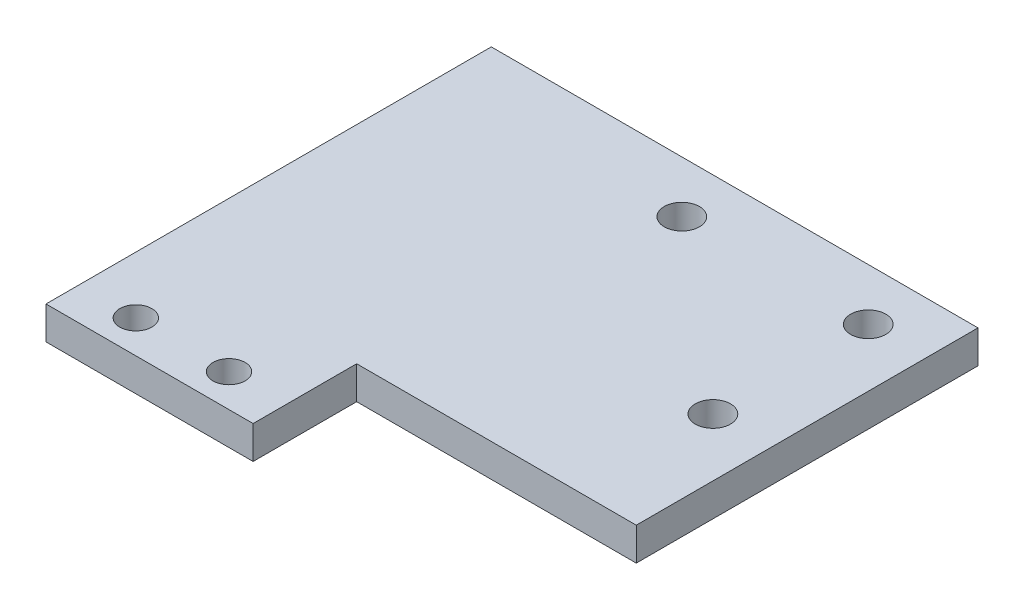
ISO-10303-21;
HEADER;
FILE_DESCRIPTION(('STEP AP214'),'2;1');
FILE_NAME('part.step','',(''),(''),'','','');
FILE_SCHEMA(('AUTOMOTIVE_DESIGN { 1 0 10303 214 1 1 1 1 }'));
ENDSEC;
DATA;
#1=APPLICATION_CONTEXT('core data for automotive mechanical design processes');
#2=APPLICATION_PROTOCOL_DEFINITION('international standard','automotive_design',2000,#1);
#3=PRODUCT_CONTEXT('',#1,'mechanical');
#4=PRODUCT('Part','Part','',(#3));
#5=PRODUCT_RELATED_PRODUCT_CATEGORY('part','',(#4));
#6=PRODUCT_DEFINITION_FORMATION('','',#4);
#7=PRODUCT_DEFINITION_CONTEXT('part definition',#1,'design');
#8=PRODUCT_DEFINITION('design','',#6,#7);
#9=PRODUCT_DEFINITION_SHAPE('','',#8);
#10=(LENGTH_UNIT() NAMED_UNIT(*) SI_UNIT(.MILLI.,.METRE.));
#11=(NAMED_UNIT(*) PLANE_ANGLE_UNIT() SI_UNIT($,.RADIAN.));
#12=(NAMED_UNIT(*) SI_UNIT($,.STERADIAN.) SOLID_ANGLE_UNIT());
#13=UNCERTAINTY_MEASURE_WITH_UNIT(LENGTH_MEASURE(1.E-05),#10,'distance_accuracy_value','');
#14=(GEOMETRIC_REPRESENTATION_CONTEXT(3) GLOBAL_UNCERTAINTY_ASSIGNED_CONTEXT((#13)) GLOBAL_UNIT_ASSIGNED_CONTEXT((#10,
#11,#12)) REPRESENTATION_CONTEXT('',''));
#15=CARTESIAN_POINT('',(0.,0.,0.));
#16=DIRECTION('',(0.,0.,1.));
#17=DIRECTION('',(1.,0.,0.));
#18=AXIS2_PLACEMENT_3D('',#15,#16,#17);
#19=CARTESIAN_POINT('',(0.,3.175,0.));
#20=DIRECTION('',(0.,-1.,0.));
#21=DIRECTION('',(0.,0.,-1.));
#22=AXIS2_PLACEMENT_3D('',#19,#20,#21);
#23=PLANE('',#22);
#24=DIRECTION('',(1.,0.,0.));
#25=VECTOR('',#24,1.);
#26=CARTESIAN_POINT('',(0.,3.175,0.));
#27=LINE('',#26,#25);
#28=CARTESIAN_POINT('',(0.,3.175,0.));
#29=VERTEX_POINT('',#28);
#30=CARTESIAN_POINT('',(19.9999999999988,3.175,0.));
#31=VERTEX_POINT('',#30);
#32=EDGE_CURVE('E139',#29,#31,#27,.T.);
#33=ORIENTED_EDGE('',*,*,#32,.T.);
#34=DIRECTION('',(0.,0.,-1.));
#35=VECTOR('',#34,1.);
#36=CARTESIAN_POINT('',(19.999999999999,3.175,-10.));
#37=LINE('',#36,#35);
#38=CARTESIAN_POINT('',(19.999999999999,3.175,-10.));
#39=VERTEX_POINT('',#38);
#40=EDGE_CURVE('E97',#31,#39,#37,.T.);
#41=ORIENTED_EDGE('',*,*,#40,.T.);
#42=DIRECTION('',(1.,0.,0.));
#43=VECTOR('',#42,1.);
#44=CARTESIAN_POINT('',(47.,3.175,-10.));
#45=LINE('',#44,#43);
#46=CARTESIAN_POINT('',(47.,3.175,-10.));
#47=VERTEX_POINT('',#46);
#48=EDGE_CURVE('E110',#39,#47,#45,.T.);
#49=ORIENTED_EDGE('',*,*,#48,.T.);
#50=DIRECTION('',(0.,0.,-1.));
#51=VECTOR('',#50,1.);
#52=CARTESIAN_POINT('',(47.,3.175,-43.));
#53=LINE('',#52,#51);
#54=CARTESIAN_POINT('',(47.,3.175,-43.));
#55=VERTEX_POINT('',#54);
#56=EDGE_CURVE('E104',#47,#55,#53,.T.);
#57=ORIENTED_EDGE('',*,*,#56,.T.);
#58=DIRECTION('',(-1.,0.,0.));
#59=VECTOR('',#58,1.);
#60=CARTESIAN_POINT('',(0.,3.175,-43.));
#61=LINE('',#60,#59);
#62=CARTESIAN_POINT('',(0.,3.175,-43.));
#63=VERTEX_POINT('',#62);
#64=EDGE_CURVE('E108',#55,#63,#61,.T.);
#65=ORIENTED_EDGE('',*,*,#64,.T.);
#66=DIRECTION('',(0.,0.,1.));
#67=VECTOR('',#66,1.);
#68=CARTESIAN_POINT('',(0.,3.175,0.));
#69=LINE('',#68,#67);
#70=EDGE_CURVE('E60',#63,#29,#69,.T.);
#71=ORIENTED_EDGE('',*,*,#70,.T.);
#72=EDGE_LOOP('',(#33,#41,#49,#57,#65,#71));
#73=FACE_BOUND('',#72,.T.);
#74=CARTESIAN_POINT('',(41.399999999998,3.175,-23.));
#75=DIRECTION('',(0.,1.,0.));
#76=DIRECTION('',(0.,0.,1.));
#77=AXIS2_PLACEMENT_3D('',#74,#75,#76);
#78=CIRCLE('',#77,1.69999999999997);
#79=CARTESIAN_POINT('',(41.399999999998,3.175,-21.3));
#80=VERTEX_POINT('',#79);
#81=EDGE_CURVE('E132',#80,#80,#78,.T.);
#82=ORIENTED_EDGE('',*,*,#81,.F.);
#83=EDGE_LOOP('',(#82));
#84=FACE_BOUND('',#83,.T.);
#85=CARTESIAN_POINT('',(41.399999999998,3.175,-38.));
#86=DIRECTION('',(0.,1.,0.));
#87=DIRECTION('',(0.,0.,1.));
#88=AXIS2_PLACEMENT_3D('',#85,#86,#87);
#89=CIRCLE('',#88,1.69999999999997);
#90=CARTESIAN_POINT('',(41.399999999998,3.175,-36.3));
#91=VERTEX_POINT('',#90);
#92=EDGE_CURVE('E213',#91,#91,#89,.T.);
#93=ORIENTED_EDGE('',*,*,#92,.F.);
#94=EDGE_LOOP('',(#93));
#95=FACE_BOUND('',#94,.T.);
#96=CARTESIAN_POINT('',(23.3999999999979,3.175,-38.));
#97=DIRECTION('',(0.,1.,0.));
#98=DIRECTION('',(0.,0.,1.));
#99=AXIS2_PLACEMENT_3D('',#96,#97,#98);
#100=CIRCLE('',#99,1.69999999999997);
#101=CARTESIAN_POINT('',(23.3999999999979,3.175,-36.3));
#102=VERTEX_POINT('',#101);
#103=EDGE_CURVE('E207',#102,#102,#100,.T.);
#104=ORIENTED_EDGE('',*,*,#103,.F.);
#105=EDGE_LOOP('',(#104));
#106=FACE_BOUND('',#105,.T.);
#107=CARTESIAN_POINT('',(14.4999999999994,3.175,-3.175));
#108=DIRECTION('',(0.,1.,0.));
#109=DIRECTION('',(0.,0.,1.));
#110=AXIS2_PLACEMENT_3D('',#107,#108,#109);
#111=CIRCLE('',#110,1.55);
#112=CARTESIAN_POINT('',(14.4999999999994,3.175,-1.625));
#113=VERTEX_POINT('',#112);
#114=EDGE_CURVE('E201',#113,#113,#111,.T.);
#115=ORIENTED_EDGE('',*,*,#114,.F.);
#116=EDGE_LOOP('',(#115));
#117=FACE_BOUND('',#116,.T.);
#118=CARTESIAN_POINT('',(5.49999999999938,3.175,-3.175));
#119=DIRECTION('',(0.,1.,0.));
#120=DIRECTION('',(0.,0.,1.));
#121=AXIS2_PLACEMENT_3D('',#118,#119,#120);
#122=CIRCLE('',#121,1.55);
#123=CARTESIAN_POINT('',(5.49999999999938,3.175,-1.625));
#124=VERTEX_POINT('',#123);
#125=EDGE_CURVE('E192',#124,#124,#122,.T.);
#126=ORIENTED_EDGE('',*,*,#125,.F.);
#127=EDGE_LOOP('',(#126));
#128=FACE_BOUND('',#127,.T.);
#129=ADVANCED_FACE('F43',(#73,#84,#95,#106,#117,#128),#23,.F.);
#130=CARTESIAN_POINT('',(0.,0.,0.));
#131=DIRECTION('',(0.,-1.,0.));
#132=DIRECTION('',(0.,0.,-1.));
#133=AXIS2_PLACEMENT_3D('',#130,#131,#132);
#134=PLANE('',#133);
#135=CARTESIAN_POINT('',(14.4999999999994,0.,-3.175));
#136=DIRECTION('',(0.,1.,0.));
#137=DIRECTION('',(0.,0.,1.));
#138=AXIS2_PLACEMENT_3D('',#135,#136,#137);
#139=CIRCLE('',#138,1.55);
#140=CARTESIAN_POINT('',(14.4999999999994,0.,-1.625));
#141=VERTEX_POINT('',#140);
#142=EDGE_CURVE('E198',#141,#141,#139,.T.);
#143=ORIENTED_EDGE('',*,*,#142,.T.);
#144=EDGE_LOOP('',(#143));
#145=FACE_BOUND('',#144,.T.);
#146=CARTESIAN_POINT('',(41.399999999998,0.,-38.));
#147=DIRECTION('',(0.,1.,0.));
#148=DIRECTION('',(0.,0.,1.));
#149=AXIS2_PLACEMENT_3D('',#146,#147,#148);
#150=CIRCLE('',#149,1.69999999999997);
#151=CARTESIAN_POINT('',(41.399999999998,0.,-36.3));
#152=VERTEX_POINT('',#151);
#153=EDGE_CURVE('E210',#152,#152,#150,.T.);
#154=ORIENTED_EDGE('',*,*,#153,.T.);
#155=EDGE_LOOP('',(#154));
#156=FACE_BOUND('',#155,.T.);
#157=DIRECTION('',(1.,0.,0.));
#158=VECTOR('',#157,1.);
#159=CARTESIAN_POINT('',(0.,0.,0.));
#160=LINE('',#159,#158);
#161=CARTESIAN_POINT('',(0.,0.,0.));
#162=VERTEX_POINT('',#161);
#163=CARTESIAN_POINT('',(19.9999999999988,0.,0.));
#164=VERTEX_POINT('',#163);
#165=EDGE_CURVE('E128',#162,#164,#160,.T.);
#166=ORIENTED_EDGE('',*,*,#165,.F.);
#167=DIRECTION('',(0.,0.,1.));
#168=VECTOR('',#167,1.);
#169=CARTESIAN_POINT('',(0.,0.,0.));
#170=LINE('',#169,#168);
#171=CARTESIAN_POINT('',(0.,0.,-43.));
#172=VERTEX_POINT('',#171);
#173=EDGE_CURVE('E89',#172,#162,#170,.T.);
#174=ORIENTED_EDGE('',*,*,#173,.F.);
#175=DIRECTION('',(-1.,0.,0.));
#176=VECTOR('',#175,1.);
#177=CARTESIAN_POINT('',(0.,0.,-43.));
#178=LINE('',#177,#176);
#179=CARTESIAN_POINT('',(47.,0.,-43.));
#180=VERTEX_POINT('',#179);
#181=EDGE_CURVE('E83',#180,#172,#178,.T.);
#182=ORIENTED_EDGE('',*,*,#181,.F.);
#183=DIRECTION('',(0.,0.,-1.));
#184=VECTOR('',#183,1.);
#185=CARTESIAN_POINT('',(47.,0.,-43.));
#186=LINE('',#185,#184);
#187=CARTESIAN_POINT('',(47.,0.,-10.));
#188=VERTEX_POINT('',#187);
#189=EDGE_CURVE('E118',#188,#180,#186,.T.);
#190=ORIENTED_EDGE('',*,*,#189,.F.);
#191=DIRECTION('',(1.,0.,0.));
#192=VECTOR('',#191,1.);
#193=CARTESIAN_POINT('',(47.,0.,-10.));
#194=LINE('',#193,#192);
#195=CARTESIAN_POINT('',(19.999999999999,0.,-10.));
#196=VERTEX_POINT('',#195);
#197=EDGE_CURVE('E134',#196,#188,#194,.T.);
#198=ORIENTED_EDGE('',*,*,#197,.F.);
#199=DIRECTION('',(0.,0.,-1.));
#200=VECTOR('',#199,1.);
#201=CARTESIAN_POINT('',(19.999999999999,0.,-10.));
#202=LINE('',#201,#200);
#203=EDGE_CURVE('E131',#164,#196,#202,.T.);
#204=ORIENTED_EDGE('',*,*,#203,.F.);
#205=EDGE_LOOP('',(#166,#174,#182,#190,#198,#204));
#206=FACE_BOUND('',#205,.T.);
#207=CARTESIAN_POINT('',(41.399999999998,0.,-23.));
#208=DIRECTION('',(0.,1.,0.));
#209=DIRECTION('',(0.,0.,1.));
#210=AXIS2_PLACEMENT_3D('',#207,#208,#209);
#211=CIRCLE('',#210,1.69999999999997);
#212=CARTESIAN_POINT('',(41.399999999998,0.,-21.3));
#213=VERTEX_POINT('',#212);
#214=EDGE_CURVE('E216',#213,#213,#211,.T.);
#215=ORIENTED_EDGE('',*,*,#214,.T.);
#216=EDGE_LOOP('',(#215));
#217=FACE_BOUND('',#216,.T.);
#218=CARTESIAN_POINT('',(23.3999999999979,0.,-38.));
#219=DIRECTION('',(0.,1.,0.));
#220=DIRECTION('',(0.,0.,1.));
#221=AXIS2_PLACEMENT_3D('',#218,#219,#220);
#222=CIRCLE('',#221,1.69999999999997);
#223=CARTESIAN_POINT('',(23.3999999999979,0.,-36.3));
#224=VERTEX_POINT('',#223);
#225=EDGE_CURVE('E204',#224,#224,#222,.T.);
#226=ORIENTED_EDGE('',*,*,#225,.T.);
#227=EDGE_LOOP('',(#226));
#228=FACE_BOUND('',#227,.T.);
#229=CARTESIAN_POINT('',(5.49999999999938,0.,-3.175));
#230=DIRECTION('',(0.,1.,0.));
#231=DIRECTION('',(0.,0.,1.));
#232=AXIS2_PLACEMENT_3D('',#229,#230,#231);
#233=CIRCLE('',#232,1.55);
#234=CARTESIAN_POINT('',(5.49999999999938,0.,-1.625));
#235=VERTEX_POINT('',#234);
#236=EDGE_CURVE('E195',#235,#235,#233,.T.);
#237=ORIENTED_EDGE('',*,*,#236,.T.);
#238=EDGE_LOOP('',(#237));
#239=FACE_BOUND('',#238,.T.);
#240=ADVANCED_FACE('F148',(#145,#156,#206,#217,#228,#239),#134,.T.);
#241=CARTESIAN_POINT('',(0.,3.175,0.));
#242=DIRECTION('',(0.,0.,-1.));
#243=DIRECTION('',(-1.,0.,0.));
#244=AXIS2_PLACEMENT_3D('',#241,#242,#243);
#245=PLANE('',#244);
#246=ORIENTED_EDGE('',*,*,#165,.T.);
#247=DIRECTION('',(0.,-1.,0.));
#248=VECTOR('',#247,1.);
#249=CARTESIAN_POINT('',(19.9999999999988,3.175,0.));
#250=LINE('',#249,#248);
#251=EDGE_CURVE('E11',#31,#164,#250,.T.);
#252=ORIENTED_EDGE('',*,*,#251,.F.);
#253=ORIENTED_EDGE('',*,*,#32,.F.);
#254=DIRECTION('',(0.,-1.,0.));
#255=VECTOR('',#254,1.);
#256=CARTESIAN_POINT('',(0.,3.175,0.));
#257=LINE('',#256,#255);
#258=EDGE_CURVE('E124',#29,#162,#257,.T.);
#259=ORIENTED_EDGE('',*,*,#258,.T.);
#260=EDGE_LOOP('',(#246,#252,#253,#259));
#261=FACE_BOUND('',#260,.T.);
#262=ADVANCED_FACE('F45',(#261),#245,.F.);
#263=CARTESIAN_POINT('',(19.999999999999,3.175,-10.));
#264=DIRECTION('',(-1.,0.,0.));
#265=DIRECTION('',(0.,0.,1.));
#266=AXIS2_PLACEMENT_3D('',#263,#264,#265);
#267=PLANE('',#266);
#268=ORIENTED_EDGE('',*,*,#203,.T.);
#269=DIRECTION('',(0.,-1.,0.));
#270=VECTOR('',#269,1.);
#271=CARTESIAN_POINT('',(19.999999999999,3.175,-10.));
#272=LINE('',#271,#270);
#273=EDGE_CURVE('E52',#39,#196,#272,.T.);
#274=ORIENTED_EDGE('',*,*,#273,.F.);
#275=ORIENTED_EDGE('',*,*,#40,.F.);
#276=ORIENTED_EDGE('',*,*,#251,.T.);
#277=EDGE_LOOP('',(#268,#274,#275,#276));
#278=FACE_BOUND('',#277,.T.);
#279=ADVANCED_FACE('F290',(#278),#267,.F.);
#280=CARTESIAN_POINT('',(47.,3.175,-10.));
#281=DIRECTION('',(0.,0.,-1.));
#282=DIRECTION('',(-1.,0.,0.));
#283=AXIS2_PLACEMENT_3D('',#280,#281,#282);
#284=PLANE('',#283);
#285=ORIENTED_EDGE('',*,*,#197,.T.);
#286=DIRECTION('',(0.,-1.,0.));
#287=VECTOR('',#286,1.);
#288=CARTESIAN_POINT('',(47.,3.175,-10.));
#289=LINE('',#288,#287);
#290=EDGE_CURVE('E119',#47,#188,#289,.T.);
#291=ORIENTED_EDGE('',*,*,#290,.F.);
#292=ORIENTED_EDGE('',*,*,#48,.F.);
#293=ORIENTED_EDGE('',*,*,#273,.T.);
#294=EDGE_LOOP('',(#285,#291,#292,#293));
#295=FACE_BOUND('',#294,.T.);
#296=ADVANCED_FACE('F145',(#295),#284,.F.);
#297=CARTESIAN_POINT('',(47.,3.175,-43.));
#298=DIRECTION('',(-1.,0.,0.));
#299=DIRECTION('',(0.,0.,1.));
#300=AXIS2_PLACEMENT_3D('',#297,#298,#299);
#301=PLANE('',#300);
#302=ORIENTED_EDGE('',*,*,#189,.T.);
#303=DIRECTION('',(0.,-1.,0.));
#304=VECTOR('',#303,1.);
#305=CARTESIAN_POINT('',(47.,3.175,-43.));
#306=LINE('',#305,#304);
#307=EDGE_CURVE('E115',#55,#180,#306,.T.);
#308=ORIENTED_EDGE('',*,*,#307,.F.);
#309=ORIENTED_EDGE('',*,*,#56,.F.);
#310=ORIENTED_EDGE('',*,*,#290,.T.);
#311=EDGE_LOOP('',(#302,#308,#309,#310));
#312=FACE_BOUND('',#311,.T.);
#313=ADVANCED_FACE('F116',(#312),#301,.F.);
#314=CARTESIAN_POINT('',(0.,3.175,-43.));
#315=DIRECTION('',(0.,0.,1.));
#316=DIRECTION('',(1.,0.,0.));
#317=AXIS2_PLACEMENT_3D('',#314,#315,#316);
#318=PLANE('',#317);
#319=ORIENTED_EDGE('',*,*,#181,.T.);
#320=DIRECTION('',(0.,-1.,0.));
#321=VECTOR('',#320,1.);
#322=CARTESIAN_POINT('',(0.,3.175,-43.));
#323=LINE('',#322,#321);
#324=EDGE_CURVE('E120',#63,#172,#323,.T.);
#325=ORIENTED_EDGE('',*,*,#324,.F.);
#326=ORIENTED_EDGE('',*,*,#64,.F.);
#327=ORIENTED_EDGE('',*,*,#307,.T.);
#328=EDGE_LOOP('',(#319,#325,#326,#327));
#329=FACE_BOUND('',#328,.T.);
#330=ADVANCED_FACE('F122',(#329),#318,.F.);
#331=CARTESIAN_POINT('',(0.,3.175,0.));
#332=DIRECTION('',(1.,0.,0.));
#333=DIRECTION('',(0.,0.,-1.));
#334=AXIS2_PLACEMENT_3D('',#331,#332,#333);
#335=PLANE('',#334);
#336=ORIENTED_EDGE('',*,*,#173,.T.);
#337=ORIENTED_EDGE('',*,*,#258,.F.);
#338=ORIENTED_EDGE('',*,*,#70,.F.);
#339=ORIENTED_EDGE('',*,*,#324,.T.);
#340=EDGE_LOOP('',(#336,#337,#338,#339));
#341=FACE_BOUND('',#340,.T.);
#342=ADVANCED_FACE('F153',(#341),#335,.F.);
#343=CARTESIAN_POINT('',(41.399999999998,3.175,-23.));
#344=DIRECTION('',(0.,-1.,0.));
#345=DIRECTION('',(0.,0.,-1.));
#346=AXIS2_PLACEMENT_3D('',#343,#344,#345);
#347=CYLINDRICAL_SURFACE('',#346,1.69999999999997);
#348=ORIENTED_EDGE('',*,*,#81,.T.);
#349=EDGE_LOOP('',(#348));
#350=FACE_BOUND('',#349,.T.);
#351=ORIENTED_EDGE('',*,*,#214,.F.);
#352=EDGE_LOOP('',(#351));
#353=FACE_BOUND('',#352,.T.);
#354=ADVANCED_FACE('F155',(#350,#353),#347,.F.);
#355=CARTESIAN_POINT('',(41.399999999998,3.175,-38.));
#356=DIRECTION('',(0.,-1.,0.));
#357=DIRECTION('',(0.,0.,-1.));
#358=AXIS2_PLACEMENT_3D('',#355,#356,#357);
#359=CYLINDRICAL_SURFACE('',#358,1.69999999999997);
#360=ORIENTED_EDGE('',*,*,#92,.T.);
#361=EDGE_LOOP('',(#360));
#362=FACE_BOUND('',#361,.T.);
#363=ORIENTED_EDGE('',*,*,#153,.F.);
#364=EDGE_LOOP('',(#363));
#365=FACE_BOUND('',#364,.T.);
#366=ADVANCED_FACE('F161',(#362,#365),#359,.F.);
#367=CARTESIAN_POINT('',(23.3999999999979,3.175,-38.));
#368=DIRECTION('',(0.,-1.,0.));
#369=DIRECTION('',(0.,0.,-1.));
#370=AXIS2_PLACEMENT_3D('',#367,#368,#369);
#371=CYLINDRICAL_SURFACE('',#370,1.69999999999997);
#372=ORIENTED_EDGE('',*,*,#103,.T.);
#373=EDGE_LOOP('',(#372));
#374=FACE_BOUND('',#373,.T.);
#375=ORIENTED_EDGE('',*,*,#225,.F.);
#376=EDGE_LOOP('',(#375));
#377=FACE_BOUND('',#376,.T.);
#378=ADVANCED_FACE('F175',(#374,#377),#371,.F.);
#379=CARTESIAN_POINT('',(14.4999999999994,3.175,-3.175));
#380=DIRECTION('',(0.,-1.,0.));
#381=DIRECTION('',(0.,0.,-1.));
#382=AXIS2_PLACEMENT_3D('',#379,#380,#381);
#383=CYLINDRICAL_SURFACE('',#382,1.55);
#384=ORIENTED_EDGE('',*,*,#114,.T.);
#385=EDGE_LOOP('',(#384));
#386=FACE_BOUND('',#385,.T.);
#387=ORIENTED_EDGE('',*,*,#142,.F.);
#388=EDGE_LOOP('',(#387));
#389=FACE_BOUND('',#388,.T.);
#390=ADVANCED_FACE('F179',(#386,#389),#383,.F.);
#391=CARTESIAN_POINT('',(5.49999999999938,3.175,-3.175));
#392=DIRECTION('',(0.,-1.,0.));
#393=DIRECTION('',(0.,0.,-1.));
#394=AXIS2_PLACEMENT_3D('',#391,#392,#393);
#395=CYLINDRICAL_SURFACE('',#394,1.55);
#396=ORIENTED_EDGE('',*,*,#125,.T.);
#397=EDGE_LOOP('',(#396));
#398=FACE_BOUND('',#397,.T.);
#399=ORIENTED_EDGE('',*,*,#236,.F.);
#400=EDGE_LOOP('',(#399));
#401=FACE_BOUND('',#400,.T.);
#402=ADVANCED_FACE('F183',(#398,#401),#395,.F.);
#403=CLOSED_SHELL('',(#129,#240,#262,#279,#296,#313,#330,#342,#354,#366,#378,#390,#402));
#404=MANIFOLD_SOLID_BREP('B2',#403);
#405=ADVANCED_BREP_SHAPE_REPRESENTATION('',(#18,#404),#14);
#406=SHAPE_DEFINITION_REPRESENTATION(#9,#405);
ENDSEC;
END-ISO-10303-21;
